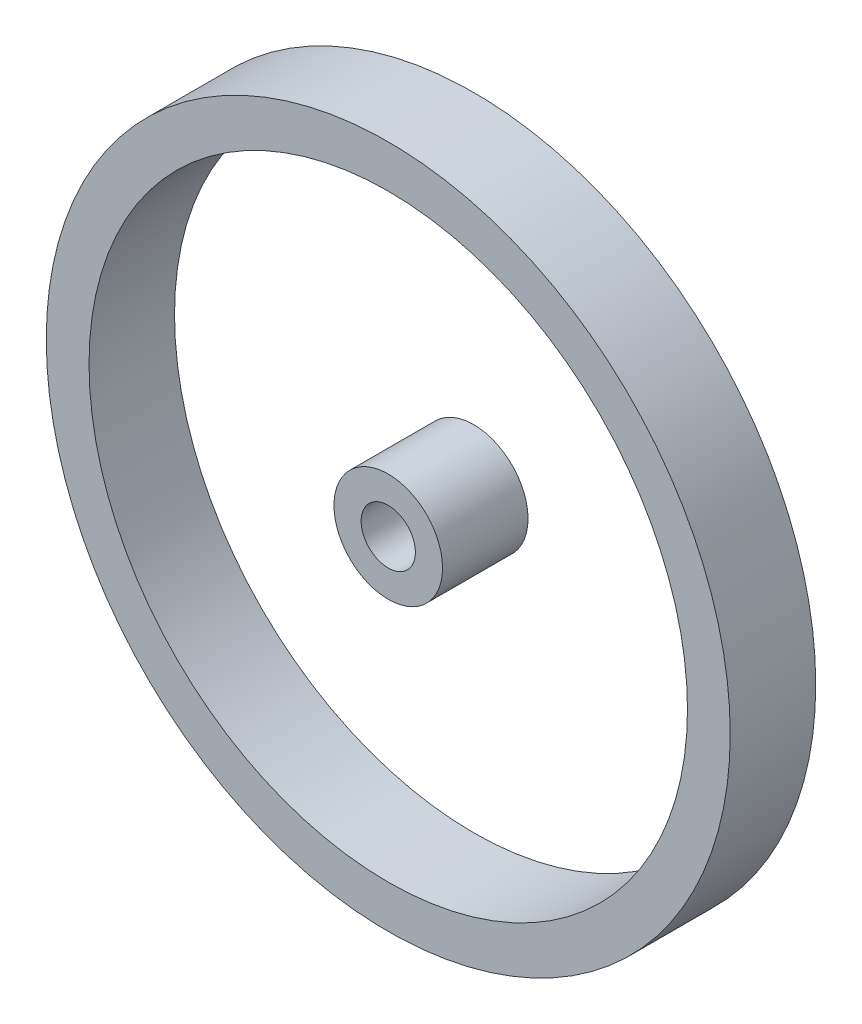
ISO-10303-21;
HEADER;
FILE_DESCRIPTION(('STEP AP214'),'2;1');
FILE_NAME('part.step','',(''),(''),'','','');
FILE_SCHEMA(('AUTOMOTIVE_DESIGN { 1 0 10303 214 1 1 1 1 }'));
ENDSEC;
DATA;
#1=APPLICATION_CONTEXT('core data for automotive mechanical design processes');
#2=APPLICATION_PROTOCOL_DEFINITION('international standard','automotive_design',2000,#1);
#3=PRODUCT_CONTEXT('',#1,'mechanical');
#4=PRODUCT('Part','Part','',(#3));
#5=PRODUCT_RELATED_PRODUCT_CATEGORY('part','',(#4));
#6=PRODUCT_DEFINITION_FORMATION('','',#4);
#7=PRODUCT_DEFINITION_CONTEXT('part definition',#1,'design');
#8=PRODUCT_DEFINITION('design','',#6,#7);
#9=PRODUCT_DEFINITION_SHAPE('','',#8);
#10=(LENGTH_UNIT() NAMED_UNIT(*) SI_UNIT(.MILLI.,.METRE.));
#11=(NAMED_UNIT(*) PLANE_ANGLE_UNIT() SI_UNIT($,.RADIAN.));
#12=(NAMED_UNIT(*) SI_UNIT($,.STERADIAN.) SOLID_ANGLE_UNIT());
#13=UNCERTAINTY_MEASURE_WITH_UNIT(LENGTH_MEASURE(1.E-05),#10,'distance_accuracy_value','');
#14=(GEOMETRIC_REPRESENTATION_CONTEXT(3) GLOBAL_UNCERTAINTY_ASSIGNED_CONTEXT((#13)) GLOBAL_UNIT_ASSIGNED_CONTEXT((#10,
#11,#12)) REPRESENTATION_CONTEXT('',''));
#15=CARTESIAN_POINT('',(0.,0.,0.));
#16=DIRECTION('',(0.,0.,1.));
#17=DIRECTION('',(1.,0.,0.));
#18=AXIS2_PLACEMENT_3D('',#15,#16,#17);
#19=CARTESIAN_POINT('',(0.,0.,10.));
#20=DIRECTION('',(0.,0.,-1.));
#21=DIRECTION('',(-1.,0.,0.));
#22=AXIS2_PLACEMENT_3D('',#19,#20,#21);
#23=CYLINDRICAL_SURFACE('',#22,3.175);
#24=CARTESIAN_POINT('',(0.,0.,10.));
#25=DIRECTION('',(0.,0.,1.));
#26=DIRECTION('',(1.,0.,0.));
#27=AXIS2_PLACEMENT_3D('',#24,#25,#26);
#28=CIRCLE('',#27,3.175);
#29=CARTESIAN_POINT('',(3.175,0.,10.));
#30=VERTEX_POINT('',#29);
#31=EDGE_CURVE('E58',#30,#30,#28,.T.);
#32=ORIENTED_EDGE('',*,*,#31,.T.);
#33=EDGE_LOOP('',(#32));
#34=FACE_BOUND('',#33,.T.);
#35=CARTESIAN_POINT('',(0.,0.,0.));
#36=DIRECTION('',(0.,0.,1.));
#37=DIRECTION('',(1.,0.,0.));
#38=AXIS2_PLACEMENT_3D('',#35,#36,#37);
#39=CIRCLE('',#38,3.175);
#40=CARTESIAN_POINT('',(3.175,0.,0.));
#41=VERTEX_POINT('',#40);
#42=EDGE_CURVE('E64',#41,#41,#39,.T.);
#43=ORIENTED_EDGE('',*,*,#42,.F.);
#44=EDGE_LOOP('',(#43));
#45=FACE_BOUND('',#44,.T.);
#46=ADVANCED_FACE('F51',(#34,#45),#23,.F.);
#47=CARTESIAN_POINT('',(0.,0.,10.));
#48=DIRECTION('',(0.,0.,-1.));
#49=DIRECTION('',(-1.,0.,0.));
#50=AXIS2_PLACEMENT_3D('',#47,#48,#49);
#51=CYLINDRICAL_SURFACE('',#50,6.35);
#52=CARTESIAN_POINT('',(0.,0.,10.));
#53=DIRECTION('',(0.,0.,1.));
#54=DIRECTION('',(1.,0.,0.));
#55=AXIS2_PLACEMENT_3D('',#52,#53,#54);
#56=CIRCLE('',#55,6.35);
#57=CARTESIAN_POINT('',(6.35,0.,10.));
#58=VERTEX_POINT('',#57);
#59=EDGE_CURVE('E12',#58,#58,#56,.T.);
#60=ORIENTED_EDGE('',*,*,#59,.F.);
#61=EDGE_LOOP('',(#60));
#62=FACE_BOUND('',#61,.T.);
#63=CARTESIAN_POINT('',(0.,0.,0.));
#64=DIRECTION('',(0.,0.,1.));
#65=DIRECTION('',(1.,0.,0.));
#66=AXIS2_PLACEMENT_3D('',#63,#64,#65);
#67=CIRCLE('',#66,6.35);
#68=CARTESIAN_POINT('',(6.35,0.,0.));
#69=VERTEX_POINT('',#68);
#70=EDGE_CURVE('E54',#69,#69,#67,.T.);
#71=ORIENTED_EDGE('',*,*,#70,.T.);
#72=EDGE_LOOP('',(#71));
#73=FACE_BOUND('',#72,.T.);
#74=ADVANCED_FACE('F71',(#62,#73),#51,.T.);
#75=CARTESIAN_POINT('',(0.,0.,10.));
#76=DIRECTION('',(0.,0.,1.));
#77=DIRECTION('',(1.,0.,0.));
#78=AXIS2_PLACEMENT_3D('',#75,#76,#77);
#79=PLANE('',#78);
#80=ORIENTED_EDGE('',*,*,#31,.F.);
#81=EDGE_LOOP('',(#80));
#82=FACE_BOUND('',#81,.T.);
#83=ORIENTED_EDGE('',*,*,#59,.T.);
#84=EDGE_LOOP('',(#83));
#85=FACE_BOUND('',#84,.T.);
#86=ADVANCED_FACE('F75',(#82,#85),#79,.T.);
#87=CARTESIAN_POINT('',(0.,0.,0.));
#88=DIRECTION('',(0.,0.,1.));
#89=DIRECTION('',(1.,0.,0.));
#90=AXIS2_PLACEMENT_3D('',#87,#88,#89);
#91=PLANE('',#90);
#92=ORIENTED_EDGE('',*,*,#42,.T.);
#93=EDGE_LOOP('',(#92));
#94=FACE_BOUND('',#93,.T.);
#95=ORIENTED_EDGE('',*,*,#70,.F.);
#96=EDGE_LOOP('',(#95));
#97=FACE_BOUND('',#96,.T.);
#98=ADVANCED_FACE('F73',(#94,#97),#91,.F.);
#99=CLOSED_SHELL('',(#46,#74,#86,#98));
#100=MANIFOLD_SOLID_BREP('B2',#99);
#101=CARTESIAN_POINT('',(0.,0.,10.));
#102=DIRECTION('',(0.,0.,-1.));
#103=DIRECTION('',(-1.,0.,0.));
#104=AXIS2_PLACEMENT_3D('',#101,#102,#103);
#105=CYLINDRICAL_SURFACE('',#104,35.);
#106=CARTESIAN_POINT('',(0.,0.,10.));
#107=DIRECTION('',(0.,0.,1.));
#108=DIRECTION('',(1.,0.,0.));
#109=AXIS2_PLACEMENT_3D('',#106,#107,#108);
#110=CIRCLE('',#109,35.);
#111=CARTESIAN_POINT('',(35.,0.,10.));
#112=VERTEX_POINT('',#111);
#113=EDGE_CURVE('E128',#112,#112,#110,.T.);
#114=ORIENTED_EDGE('',*,*,#113,.T.);
#115=EDGE_LOOP('',(#114));
#116=FACE_BOUND('',#115,.T.);
#117=CARTESIAN_POINT('',(0.,0.,0.));
#118=DIRECTION('',(0.,0.,1.));
#119=DIRECTION('',(1.,0.,0.));
#120=AXIS2_PLACEMENT_3D('',#117,#118,#119);
#121=CIRCLE('',#120,35.);
#122=CARTESIAN_POINT('',(35.,0.,0.));
#123=VERTEX_POINT('',#122);
#124=EDGE_CURVE('E134',#123,#123,#121,.T.);
#125=ORIENTED_EDGE('',*,*,#124,.F.);
#126=EDGE_LOOP('',(#125));
#127=FACE_BOUND('',#126,.T.);
#128=ADVANCED_FACE('F121',(#116,#127),#105,.F.);
#129=CARTESIAN_POINT('',(0.,0.,10.));
#130=DIRECTION('',(0.,0.,-1.));
#131=DIRECTION('',(-1.,0.,0.));
#132=AXIS2_PLACEMENT_3D('',#129,#130,#131);
#133=CYLINDRICAL_SURFACE('',#132,40.);
#134=CARTESIAN_POINT('',(0.,0.,10.));
#135=DIRECTION('',(0.,0.,1.));
#136=DIRECTION('',(1.,0.,0.));
#137=AXIS2_PLACEMENT_3D('',#134,#135,#136);
#138=CIRCLE('',#137,40.);
#139=CARTESIAN_POINT('',(40.,0.,10.));
#140=VERTEX_POINT('',#139);
#141=EDGE_CURVE('E50',#140,#140,#138,.T.);
#142=ORIENTED_EDGE('',*,*,#141,.F.);
#143=EDGE_LOOP('',(#142));
#144=FACE_BOUND('',#143,.T.);
#145=CARTESIAN_POINT('',(0.,0.,0.));
#146=DIRECTION('',(0.,0.,1.));
#147=DIRECTION('',(1.,0.,0.));
#148=AXIS2_PLACEMENT_3D('',#145,#146,#147);
#149=CIRCLE('',#148,40.);
#150=CARTESIAN_POINT('',(40.,0.,0.));
#151=VERTEX_POINT('',#150);
#152=EDGE_CURVE('E124',#151,#151,#149,.T.);
#153=ORIENTED_EDGE('',*,*,#152,.T.);
#154=EDGE_LOOP('',(#153));
#155=FACE_BOUND('',#154,.T.);
#156=ADVANCED_FACE('F141',(#144,#155),#133,.T.);
#157=CARTESIAN_POINT('',(0.,0.,10.));
#158=DIRECTION('',(0.,0.,1.));
#159=DIRECTION('',(1.,0.,0.));
#160=AXIS2_PLACEMENT_3D('',#157,#158,#159);
#161=PLANE('',#160);
#162=ORIENTED_EDGE('',*,*,#113,.F.);
#163=EDGE_LOOP('',(#162));
#164=FACE_BOUND('',#163,.T.);
#165=ORIENTED_EDGE('',*,*,#141,.T.);
#166=EDGE_LOOP('',(#165));
#167=FACE_BOUND('',#166,.T.);
#168=ADVANCED_FACE('F145',(#164,#167),#161,.T.);
#169=CARTESIAN_POINT('',(0.,0.,0.));
#170=DIRECTION('',(0.,0.,1.));
#171=DIRECTION('',(1.,0.,0.));
#172=AXIS2_PLACEMENT_3D('',#169,#170,#171);
#173=PLANE('',#172);
#174=ORIENTED_EDGE('',*,*,#124,.T.);
#175=EDGE_LOOP('',(#174));
#176=FACE_BOUND('',#175,.T.);
#177=ORIENTED_EDGE('',*,*,#152,.F.);
#178=EDGE_LOOP('',(#177));
#179=FACE_BOUND('',#178,.T.);
#180=ADVANCED_FACE('F143',(#176,#179),#173,.F.);
#181=CLOSED_SHELL('',(#128,#156,#168,#180));
#182=MANIFOLD_SOLID_BREP('B7',#181);
#183=ADVANCED_BREP_SHAPE_REPRESENTATION('',(#18,#100,#182),#14);
#184=SHAPE_DEFINITION_REPRESENTATION(#9,#183);
ENDSEC;
END-ISO-10303-21;
